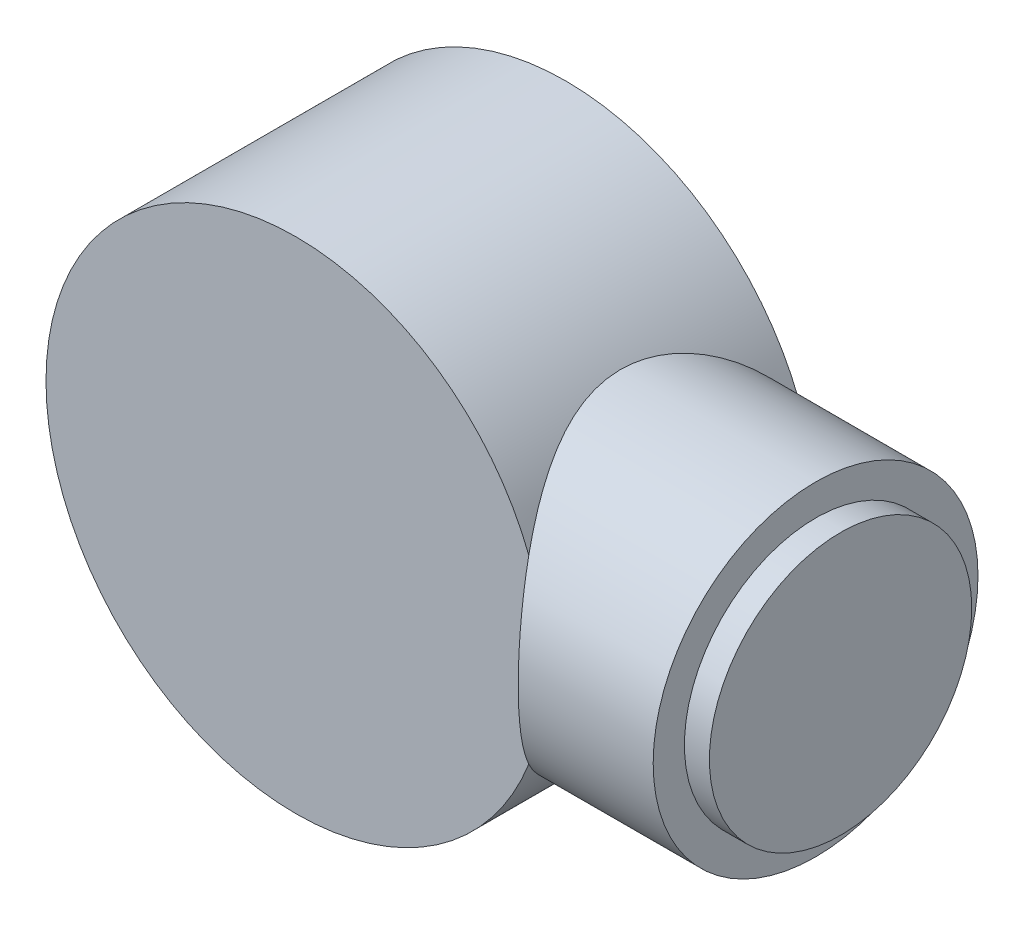
ISO-10303-21;
HEADER;
FILE_DESCRIPTION(('STEP AP214'),'2;1');
FILE_NAME('part.step','',(''),(''),'','','');
FILE_SCHEMA(('AUTOMOTIVE_DESIGN { 1 0 10303 214 1 1 1 1 }'));
ENDSEC;
DATA;
#1=APPLICATION_CONTEXT('core data for automotive mechanical design processes');
#2=APPLICATION_PROTOCOL_DEFINITION('international standard','automotive_design',2000,#1);
#3=PRODUCT_CONTEXT('',#1,'mechanical');
#4=PRODUCT('Part','Part','',(#3));
#5=PRODUCT_RELATED_PRODUCT_CATEGORY('part','',(#4));
#6=PRODUCT_DEFINITION_FORMATION('','',#4);
#7=PRODUCT_DEFINITION_CONTEXT('part definition',#1,'design');
#8=PRODUCT_DEFINITION('design','',#6,#7);
#9=PRODUCT_DEFINITION_SHAPE('','',#8);
#10=(LENGTH_UNIT() NAMED_UNIT(*) SI_UNIT(.MILLI.,.METRE.));
#11=(NAMED_UNIT(*) PLANE_ANGLE_UNIT() SI_UNIT($,.RADIAN.));
#12=(NAMED_UNIT(*) SI_UNIT($,.STERADIAN.) SOLID_ANGLE_UNIT());
#13=UNCERTAINTY_MEASURE_WITH_UNIT(LENGTH_MEASURE(1.E-05),#10,'distance_accuracy_value','');
#14=(GEOMETRIC_REPRESENTATION_CONTEXT(3) GLOBAL_UNCERTAINTY_ASSIGNED_CONTEXT((#13)) GLOBAL_UNIT_ASSIGNED_CONTEXT((#10,
#11,#12)) REPRESENTATION_CONTEXT('',''));
#15=CARTESIAN_POINT('',(0.,0.,0.));
#16=DIRECTION('',(0.,0.,1.));
#17=DIRECTION('',(1.,0.,0.));
#18=AXIS2_PLACEMENT_3D('',#15,#16,#17);
#19=CARTESIAN_POINT('',(0.,0.,54.));
#20=DIRECTION('',(0.,0.,-1.));
#21=DIRECTION('',(-1.,0.,0.));
#22=AXIS2_PLACEMENT_3D('',#19,#20,#21);
#23=CYLINDRICAL_SURFACE('',#22,50.);
#24=CARTESIAN_POINT('',(0.,0.,54.));
#25=DIRECTION('',(0.,0.,1.));
#26=DIRECTION('',(1.,0.,0.));
#27=AXIS2_PLACEMENT_3D('',#24,#25,#26);
#28=CIRCLE('',#27,50.);
#29=CARTESIAN_POINT('',(46.6127664915954,18.0900525151255,54.));
#30=VERTEX_POINT('',#29);
#31=CARTESIAN_POINT('',(46.6127664915954,-18.0900525151255,54.));
#32=VERTEX_POINT('',#31);
#33=EDGE_CURVE('E42',#30,#32,#28,.T.);
#34=ORIENTED_EDGE('',*,*,#33,.F.);
#35=CARTESIAN_POINT('',(50.,0.,-5.5));
#36=CARTESIAN_POINT('',(49.9999950832951,0.820379898340808,-5.49999466046045));
#37=CARTESIAN_POINT('',(49.9797625626082,1.64084726886599,-5.46889183519829));
#38=CARTESIAN_POINT('',(49.8993279047576,3.27517627569682,-5.34493934746414));
#39=CARTESIAN_POINT('',(49.8391202522668,4.08903698480234,-5.25208116466715));
#40=CARTESIAN_POINT('',(49.6801748227282,5.70432342494345,-5.00591516436292));
#41=CARTESIAN_POINT('',(49.5814093942654,6.50573980179267,-4.85256396392356));
#42=CARTESIAN_POINT('',(49.3477186738602,8.08972592140923,-4.48756849820513));
#43=CARTESIAN_POINT('',(49.212794126871,8.87229605208658,-4.2759254338575));
#44=CARTESIAN_POINT('',(48.9105837019917,10.409890979968,-3.79820184570894));
#45=CARTESIAN_POINT('',(48.7434562311797,11.1650299429453,-3.53238743761594));
#46=CARTESIAN_POINT('',(48.3799715633452,12.6475670057983,-2.94868585443072));
#47=CARTESIAN_POINT('',(48.1836142984633,13.3749650412661,-2.63079855844675));
#48=CARTESIAN_POINT('',(47.7655753618638,14.7986574365594,-1.9460483734245));
#49=CARTESIAN_POINT('',(47.5438947789436,15.4949531318671,-1.57918758992853));
#50=CARTESIAN_POINT('',(47.0793256843562,16.853866771853,-0.799477265192811));
#51=CARTESIAN_POINT('',(46.8364361825179,17.5164831418727,-0.38662557654837));
#52=CARTESIAN_POINT('',(46.31288226742,18.8594396012604,0.518300920156271));
#53=CARTESIAN_POINT('',(46.030755539401,19.5366956160193,1.01410599191766));
#54=CARTESIAN_POINT('',(45.4522443941303,20.8472210237898,2.05320041309447));
#55=CARTESIAN_POINT('',(45.1558593389838,21.4804884457185,2.59649188786588));
#56=CARTESIAN_POINT('',(44.5542181709047,22.7021098692218,3.72858800385993));
#57=CARTESIAN_POINT('',(44.2489510586984,23.2904045982318,4.31745071869159));
#58=CARTESIAN_POINT('',(43.635955205152,24.4195865043336,5.53782423965643));
#59=CARTESIAN_POINT('',(43.3282263201168,24.9604708916954,6.16933755157977));
#60=CARTESIAN_POINT('',(42.6711530158535,26.0700560672088,7.57025191176403));
#61=CARTESIAN_POINT('',(42.3224327873107,26.6309119255251,8.34618501317327));
#62=CARTESIAN_POINT('',(41.6406131212886,27.6848953678642,9.94957044777783));
#63=CARTESIAN_POINT('',(41.3075169872343,28.1780086711108,10.7770335907289));
#64=CARTESIAN_POINT('',(40.669017868988,29.0919462219696,12.4796375672601));
#65=CARTESIAN_POINT('',(40.3635774153682,29.5128689906529,13.3547112402174));
#66=CARTESIAN_POINT('',(39.7925815815168,30.2783525612671,15.1499984864518));
#67=CARTESIAN_POINT('',(39.5270080979029,30.6229480570224,16.0701913179829));
#68=CARTESIAN_POINT('',(39.1151707569848,31.1461312138078,17.6898576211882));
#69=CARTESIAN_POINT('',(38.9562369559204,31.3442611136038,18.3798478972654));
#70=CARTESIAN_POINT('',(38.6709512544293,31.695564794545,19.7777927595638));
#71=CARTESIAN_POINT('',(38.5445940631359,31.848745876524,20.4857444080825));
#72=CARTESIAN_POINT('',(38.328980642896,32.1079075043085,21.9148379579285));
#73=CARTESIAN_POINT('',(38.2396737765112,32.213952486247,22.6359604408029));
#74=CARTESIAN_POINT('',(38.1013167187525,32.3774801531489,24.0875823449805));
#75=CARTESIAN_POINT('',(38.0522668939434,32.4349623959195,24.8180818516057));
#76=CARTESIAN_POINT('',(37.9963316864904,32.5004721086949,26.2854803451552));
#77=CARTESIAN_POINT('',(37.9895935697563,32.508326850756,27.0223927537606));
#78=CARTESIAN_POINT('',(38.0189586121582,32.4739783985208,28.4941838153935));
#79=CARTESIAN_POINT('',(38.0550619680412,32.4317749743356,29.2290624590657));
#80=CARTESIAN_POINT('',(38.168648429343,32.298017031725,30.691581698894));
#81=CARTESIAN_POINT('',(38.2461617042717,32.2064265315171,31.4192166233723));
#82=CARTESIAN_POINT('',(38.43953216099,31.9753805209268,32.8616220334858));
#83=CARTESIAN_POINT('',(38.5553901243586,31.8359240348907,33.5763922565868));
#84=CARTESIAN_POINT('',(38.8165742872301,31.5168911106297,34.9639466936341));
#85=CARTESIAN_POINT('',(38.9607173353993,31.33890276179,35.6373226704315));
#86=CARTESIAN_POINT('',(39.2765368375223,30.9421702821062,36.9655787328999));
#87=CARTESIAN_POINT('',(39.4482240312041,30.7234102485866,37.6204514863652));
#88=CARTESIAN_POINT('',(39.8145826406525,30.247135742793,38.9093625725826));
#89=CARTESIAN_POINT('',(40.0092566397756,29.9896169137431,39.5433985533529));
#90=CARTESIAN_POINT('',(40.4170288058455,29.4377556466839,40.7888514561042));
#91=CARTESIAN_POINT('',(40.6301227285746,29.1434216844657,41.4002735425394));
#92=CARTESIAN_POINT('',(41.1140079381856,28.457817543033,42.7180777586586));
#93=CARTESIAN_POINT('',(41.3878797638847,28.0588852943435,43.4193502974399));
#94=CARTESIAN_POINT('',(41.949038749162,27.2127893027469,44.7865262043896));
#95=CARTESIAN_POINT('',(42.2363271724089,26.7656210114159,45.452426228251));
#96=CARTESIAN_POINT('',(42.8182561243996,25.8244717865271,46.7481253404724));
#97=CARTESIAN_POINT('',(43.1129043018876,25.330440520131,47.3778844200849));
#98=CARTESIAN_POINT('',(43.7033294929278,24.2975913742116,48.5989955295088));
#99=CARTESIAN_POINT('',(43.9991065762731,23.7587706814012,49.1903451426055));
#100=CARTESIAN_POINT('',(44.6433757161103,22.5286511323823,50.4440586838091));
#101=CARTESIAN_POINT('',(44.9909276528173,21.8280825337455,51.0978541444607));
#102=CARTESIAN_POINT('',(45.6707389230497,20.3674410882344,52.3444130595286));
#103=CARTESIAN_POINT('',(46.0029955959866,19.6073579505351,52.9371659176914));
#104=CARTESIAN_POINT('',(46.6432717696123,18.0313075910058,54.0565210365045));
#105=CARTESIAN_POINT('',(46.9513108856265,17.2153866190105,54.5831770437384));
#106=CARTESIAN_POINT('',(47.5350545534779,15.531013891883,55.5654939457799));
#107=CARTESIAN_POINT('',(47.8107680817938,14.6625768219423,56.0211745613144));
#108=CARTESIAN_POINT('',(48.2712989219017,13.0551073362084,56.773110475653));
#109=CARTESIAN_POINT('',(48.4633033177363,12.324514168495,57.0830659962705));
#110=CARTESIAN_POINT('',(48.8176192333411,10.8362739804481,57.6505975880767));
#111=CARTESIAN_POINT('',(48.979934361987,10.0786302616407,57.9081800258954));
#112=CARTESIAN_POINT('',(49.2713253417834,8.54098217221501,58.3678991154421));
#113=CARTESIAN_POINT('',(49.4004230450817,7.76099287899599,58.5700722240386));
#114=CARTESIAN_POINT('',(49.6226053964351,6.18317573262193,58.9166205684597));
#115=CARTESIAN_POINT('',(49.7156894160999,5.38534756845951,59.0609947957731));
#116=CARTESIAN_POINT('',(49.8639036202448,3.77460108589335,59.2903482323196));
#117=CARTESIAN_POINT('',(49.9188902972156,2.9616374291221,59.3751028808245));
#118=CARTESIAN_POINT('',(49.9889806039512,1.32990448445416,59.4830706056691));
#119=CARTESIAN_POINT('',(50.0040842099017,0.511135193091196,59.506283645262));
#120=CARTESIAN_POINT('',(49.9940280170243,-1.12558702772942,59.4908120509778));
#121=CARTESIAN_POINT('',(49.9688671194818,-1.9435399343006,59.4521257280265));
#122=CARTESIAN_POINT('',(49.8789112577068,-3.57199749573233,59.3134426463783));
#123=CARTESIAN_POINT('',(49.8141175484482,-4.38250238560966,59.2134478290158));
#124=CARTESIAN_POINT('',(49.6514918470381,-5.94197489256988,58.9613719584213));
#125=CARTESIAN_POINT('',(49.555854505623,-6.6917350268788,58.8127432372991));
#126=CARTESIAN_POINT('',(49.3329577485776,-8.1744282627694,58.4644026294863));
#127=CARTESIAN_POINT('',(49.2056998557011,-8.907362172797,58.2646932026805));
#128=CARTESIAN_POINT('',(48.9220905433369,-10.3523561917551,57.8164089830273));
#129=CARTESIAN_POINT('',(48.7657373107556,-11.0644149966383,57.5678311448613));
#130=CARTESIAN_POINT('',(48.4268841832775,-12.4641703227049,57.0242943573914));
#131=CARTESIAN_POINT('',(48.2443828654948,-13.1518655155656,56.7293328839699));
#132=CARTESIAN_POINT('',(47.8429790386047,-14.5468935746808,56.0735703190451));
#133=CARTESIAN_POINT('',(47.6224282140744,-15.2522697974981,55.7096182026578));
#134=CARTESIAN_POINT('',(47.1593126222709,-16.629097865148,54.9346965691568));
#135=CARTESIAN_POINT('',(46.9167470587903,-17.3005484816245,54.5237253513626));
#136=CARTESIAN_POINT('',(46.4138194489232,-18.607742420822,53.6574027719117));
#137=CARTESIAN_POINT('',(46.1534470794155,-19.2434646350104,53.2020256005709));
#138=CARTESIAN_POINT('',(45.619526143917,-20.4770764710835,52.2496858797039));
#139=CARTESIAN_POINT('',(45.3459768617906,-21.074964032645,51.7527210688985));
#140=CARTESIAN_POINT('',(44.7471563176791,-22.3213173683831,50.6391921817521));
#141=CARTESIAN_POINT('',(44.4204496488134,-22.9632199419752,50.0160396905248));
#142=CARTESIAN_POINT('',(43.7630045869561,-24.1926746957852,48.7200933671887));
#143=CARTESIAN_POINT('',(43.4322656332202,-24.7802192169113,48.047292563529));
#144=CARTESIAN_POINT('',(42.7745161992376,-25.8990740511106,46.6541722015348));
#145=CARTESIAN_POINT('',(42.4475074152823,-26.4303596241356,45.9338319617479));
#146=CARTESIAN_POINT('',(41.8059041408205,-27.4339387672869,44.4479953540767));
#147=CARTESIAN_POINT('',(41.4913079318813,-27.906240523045,43.6825052737353));
#148=CARTESIAN_POINT('',(40.9200564815249,-28.7362441351099,42.2022955754751));
#149=CARTESIAN_POINT('',(40.6609659921665,-29.1008956870287,41.4924109597111));
#150=CARTESIAN_POINT('',(40.1664965087985,-29.779672463042,40.0408179524925));
#151=CARTESIAN_POINT('',(39.9311170218804,-30.0937987375458,39.2991102230396));
#152=CARTESIAN_POINT('',(39.4917120575915,-30.6681484086005,37.7873745813625));
#153=CARTESIAN_POINT('',(39.287640214774,-30.9284517177363,37.0173906827655));
#154=CARTESIAN_POINT('',(38.9178700773443,-31.3924770297742,35.4515519018164));
#155=CARTESIAN_POINT('',(38.7521647978538,-31.5962093331374,34.6557017587133));
#156=CARTESIAN_POINT('',(38.487621867937,-31.9176987315613,33.1645325250141));
#157=CARTESIAN_POINT('',(38.3824721686329,-32.0437830280959,32.4721239485102));
#158=CARTESIAN_POINT('',(38.2084463267924,-32.2510939378217,31.0761112799988));
#159=CARTESIAN_POINT('',(38.139566259711,-32.3323254043466,30.3725084077581));
#160=CARTESIAN_POINT('',(38.0406628594831,-32.4486339223221,28.95921823179));
#161=CARTESIAN_POINT('',(38.0106142233053,-32.4837410292135,28.2495351938049));
#162=CARTESIAN_POINT('',(37.9904569091207,-32.5073136396741,26.8288028909469));
#163=CARTESIAN_POINT('',(38.0003490888071,-32.495778141635,26.1177535970627));
#164=CARTESIAN_POINT('',(38.059663883183,-32.4262861105484,24.700175772028));
#165=CARTESIAN_POINT('',(38.1090550774856,-32.368366474764,23.9936440973489));
#166=CARTESIAN_POINT('',(38.2454441231086,-32.2070967599132,22.5895137156665));
#167=CARTESIAN_POINT('',(38.3324416199641,-32.1037471090554,21.8919149245286));
#168=CARTESIAN_POINT('',(38.5410535221566,-31.8530019051811,20.509194774244));
#169=CARTESIAN_POINT('',(38.662705517609,-31.7055585145022,19.824087828478));
#170=CARTESIAN_POINT('',(38.9366337080108,-31.3685451393114,18.4705803278069));
#171=CARTESIAN_POINT('',(39.0889139006484,-31.1789696552474,17.8021819665759));
#172=CARTESIAN_POINT('',(39.4681515862117,-30.6982762499881,16.291855828066));
#173=CARTESIAN_POINT('',(39.7039201757252,-30.3936788069919,15.4564089668611));
#174=CARTESIAN_POINT('',(40.2095373547831,-29.721538113857,13.821926549327));
#175=CARTESIAN_POINT('',(40.4793956364613,-29.3539769517075,13.0229014364316));
#176=CARTESIAN_POINT('',(41.0440210917243,-28.5591694410698,11.4632462946186));
#177=CARTESIAN_POINT('',(41.3388144790771,-28.1318599644147,10.7026580493571));
#178=CARTESIAN_POINT('',(41.9442700701395,-27.2208981243104,9.22283282769884));
#179=CARTESIAN_POINT('',(42.2549313196396,-26.7372491465867,8.50359337032016));
#180=CARTESIAN_POINT('',(42.8889875449583,-25.7080858845502,7.09735699713856));
#181=CARTESIAN_POINT('',(43.2125052568565,-25.1617288893835,6.41103263250462));
#182=CARTESIAN_POINT('',(43.8598896717567,-24.0154817005351,5.0848268798128));
#183=CARTESIAN_POINT('',(44.1837563765708,-23.4155912275827,4.4449457340691));
#184=CARTESIAN_POINT('',(44.8246827044135,-22.1639850361142,3.2139037879028));
#185=CARTESIAN_POINT('',(45.1417405445902,-21.5122559491886,2.62275563555921));
#186=CARTESIAN_POINT('',(45.7620737335855,-20.1590357237669,1.49234233674686));
#187=CARTESIAN_POINT('',(46.0653483829597,-19.4575420645242,0.953079821728656));
#188=CARTESIAN_POINT('',(46.6810020521624,-17.9339091298916,-0.121560308825123));
#189=CARTESIAN_POINT('',(46.991220745991,-17.1067350387869,-0.651074470906869));
#190=CARTESIAN_POINT('',(47.5783138826708,-15.3986971256461,-1.63744016453904));
#191=CARTESIAN_POINT('',(47.855183285751,-14.5178252189714,-2.09428071693315));
#192=CARTESIAN_POINT('',(48.3668793423392,-12.7092691977611,-2.92847198378674));
#193=CARTESIAN_POINT('',(48.6017836772997,-11.7816757386604,-3.30596980304276));
#194=CARTESIAN_POINT('',(48.917289614073,-10.3602514667507,-3.80857072157964));
#195=CARTESIAN_POINT('',(49.016307598532,-9.88149221910737,-3.96548291174638));
#196=CARTESIAN_POINT('',(49.2013116274098,-8.91476468347579,-4.25750903195082));
#197=CARTESIAN_POINT('',(49.2872955229403,-8.42679489185499,-4.39261936782316));
#198=CARTESIAN_POINT('',(49.4696847366718,-7.29205135260537,-4.67830917492835));
#199=CARTESIAN_POINT('',(49.561201378512,-6.6424628353478,-4.82092889076201));
#200=CARTESIAN_POINT('',(49.7191592253278,-5.33292853081827,-5.06639380811066));
#201=CARTESIAN_POINT('',(49.7856047759838,-4.67298455917691,-5.1692459027954));
#202=CARTESIAN_POINT('',(49.8923502038399,-3.34607343613181,-5.33420136120816));
#203=CARTESIAN_POINT('',(49.9326568726316,-2.67910815486154,-5.39631530986083));
#204=CARTESIAN_POINT('',(49.9864860599114,-1.3414484839905,-5.47922032849765));
#205=CARTESIAN_POINT('',(50.0000040199631,-0.670753479198282,-5.50000436567832));
#206=CARTESIAN_POINT('',(50.,0.,-5.5));
#207=B_SPLINE_CURVE_WITH_KNOTS('',3,(#35,#36,#37,#38,#39,#40,#41,#42,#43,#44,#45,#46,#47,#48,
#49,#50,#51,#52,#53,#54,#55,#56,#57,#58,#59,#60,#61,#62,#63,#64,#65,#66,#67,#68,#69,#70,#71,#72,
#73,#74,#75,#76,#77,#78,#79,#80,#81,#82,#83,#84,#85,#86,#87,#88,#89,#90,#91,#92,#93,#94,#95,#96,
#97,#98,#99,#100,#101,#102,#103,#104,#105,#106,#107,#108,#109,#110,#111,#112,#113,#114,#115,
#116,#117,#118,#119,#120,#121,#122,#123,#124,#125,#126,#127,#128,#129,#130,#131,#132,#133,#134,
#135,#136,#137,#138,#139,#140,#141,#142,#143,#144,#145,#146,#147,#148,#149,#150,#151,#152,#153,
#154,#155,#156,#157,#158,#159,#160,#161,#162,#163,#164,#165,#166,#167,#168,#169,#170,#171,#172,
#173,#174,#175,#176,#177,#178,#179,#180,#181,#182,#183,#184,#185,#186,#187,#188,#189,#190,#191,
#192,#193,#194,#195,#196,#197,#198,#199,#200,#201,#202,#203,#204,#205,#206),.UNSPECIFIED.,.T.,
.F.,(4,2,2,2,2,2,2,2,2,2,2,2,2,2,2,2,2,2,2,2,2,2,2,2,2,2,2,2,2,2,2,2,2,2,2,2,2,2,2,2,2,2,2,2,2,
2,2,2,2,2,2,2,2,2,2,2,2,2,2,2,2,2,2,2,2,2,2,2,2,2,2,2,2,2,2,2,2,2,2,2,2,2,2,2,2,4),(0.,
2.46045993003765,4.92125939771797,7.38382686034164,9.84634359284154,12.2970428769451,
14.7477478506417,17.1983474938338,19.6490616082808,22.3029292718831,24.9569157759163,
27.6143419106252,30.2719243093767,33.3251156223354,36.3789495926578,39.4285821341122,
42.4768256369194,44.6805266408034,46.8838695090903,49.0841910232989,51.2845325725393,
53.4925281856819,55.7005339389497,57.9101505497284,60.1198122018549,62.2515577277178,
64.3841364708946,66.5169551110068,68.6492836220793,71.2029639599345,73.7568853082476,
76.3135814239511,78.8704382508673,81.9247620382729,84.9796151285971,88.031967848395,
91.0834709439921,93.5305607781958,95.9773529586959,98.4225313729449,100.867752450345,
103.322134985925,105.776518987026,108.230969963086,110.685343222929,112.993712174889,
115.301969984042,117.61037168185,119.918899042404,122.38786060554,124.85691149924,
127.327406109676,129.798035137756,132.652317947386,135.507002317129,138.362936875042,
141.218474651779,143.733409825373,146.248292707263,148.759414421274,151.270078609418,
153.402630947015,155.534952484961,157.665883874566,159.796861024257,161.926144723967,
164.055408354167,166.186990472554,168.318850992474,171.074796064786,173.83152645837,
176.591191849729,179.35069148432,182.152963084706,184.955249304694,187.758260550462,
190.5614138799,193.646940868185,196.73293356028,199.813153211307,201.352923022289,
202.892946414719,204.905180739947,206.91706611552,208.928428538954,210.940133191687),.UNSPECIFIED.);
#208=CARTESIAN_POINT('',(46.6127664915954,18.0900525151255,0.));
#209=VERTEX_POINT('',#208);
#210=EDGE_CURVE('E69',#209,#30,#207,.T.);
#211=ORIENTED_EDGE('',*,*,#210,.F.);
#212=CARTESIAN_POINT('',(0.,0.,0.));
#213=DIRECTION('',(0.,0.,1.));
#214=DIRECTION('',(1.,0.,0.));
#215=AXIS2_PLACEMENT_3D('',#212,#213,#214);
#216=CIRCLE('',#215,50.);
#217=CARTESIAN_POINT('',(46.6127664915954,-18.0900525151255,0.));
#218=VERTEX_POINT('',#217);
#219=EDGE_CURVE('E37',#209,#218,#216,.T.);
#220=ORIENTED_EDGE('',*,*,#219,.T.);
#221=EDGE_CURVE('E50',#32,#218,#207,.T.);
#222=ORIENTED_EDGE('',*,*,#221,.F.);
#223=EDGE_LOOP('',(#34,#211,#220,#222));
#224=FACE_BOUND('',#223,.T.);
#225=ADVANCED_FACE('F34',(#224),#23,.T.);
#226=CARTESIAN_POINT('',(0.,0.,54.));
#227=DIRECTION('',(0.,0.,1.));
#228=DIRECTION('',(1.,0.,0.));
#229=AXIS2_PLACEMENT_3D('',#226,#227,#228);
#230=PLANE('',#229);
#231=ORIENTED_EDGE('',*,*,#33,.T.);
#232=CARTESIAN_POINT('',(0.,0.,54.));
#233=DIRECTION('',(0.,0.,1.));
#234=DIRECTION('',(1.,0.,0.));
#235=AXIS2_PLACEMENT_3D('',#232,#233,#234);
#236=CIRCLE('',#235,50.);
#237=EDGE_CURVE('E56',#30,#32,#236,.F.);
#238=ORIENTED_EDGE('',*,*,#237,.F.);
#239=EDGE_LOOP('',(#231,#238));
#240=FACE_BOUND('',#239,.T.);
#241=ADVANCED_FACE('F112',(#240),#230,.T.);
#242=CARTESIAN_POINT('',(0.,0.,0.));
#243=DIRECTION('',(0.,0.,1.));
#244=DIRECTION('',(1.,0.,0.));
#245=AXIS2_PLACEMENT_3D('',#242,#243,#244);
#246=PLANE('',#245);
#247=ORIENTED_EDGE('',*,*,#219,.F.);
#248=EDGE_CURVE('E66',#218,#209,#216,.T.);
#249=ORIENTED_EDGE('',*,*,#248,.F.);
#250=EDGE_LOOP('',(#247,#249));
#251=FACE_BOUND('',#250,.T.);
#252=ADVANCED_FACE('F64',(#251),#246,.F.);
#253=CARTESIAN_POINT('',(0.,0.,54.));
#254=DIRECTION('',(0.,0.,-1.));
#255=DIRECTION('',(-1.,0.,0.));
#256=AXIS2_PLACEMENT_3D('',#253,#254,#255);
#257=CYLINDRICAL_SURFACE('',#256,50.);
#258=ORIENTED_EDGE('',*,*,#248,.T.);
#259=EDGE_CURVE('E76',#218,#209,#207,.T.);
#260=ORIENTED_EDGE('',*,*,#259,.F.);
#261=EDGE_LOOP('',(#258,#260));
#262=FACE_BOUND('',#261,.T.);
#263=ADVANCED_FACE('F78',(#262),#257,.F.);
#264=CARTESIAN_POINT('',(77.,0.,27.));
#265=DIRECTION('',(1.,0.,0.));
#266=DIRECTION('',(0.,0.,-1.));
#267=AXIS2_PLACEMENT_3D('',#264,#265,#266);
#268=PLANE('',#267);
#269=CARTESIAN_POINT('',(77.,0.,27.));
#270=DIRECTION('',(1.,0.,0.));
#271=DIRECTION('',(0.,0.,-1.));
#272=AXIS2_PLACEMENT_3D('',#269,#270,#271);
#273=CIRCLE('',#272,26.25);
#274=CARTESIAN_POINT('',(77.,0.,0.750000000000001));
#275=VERTEX_POINT('',#274);
#276=EDGE_CURVE('E11',#275,#275,#273,.T.);
#277=ORIENTED_EDGE('',*,*,#276,.F.);
#278=EDGE_LOOP('',(#277));
#279=FACE_BOUND('',#278,.T.);
#280=CARTESIAN_POINT('',(77.,0.,27.));
#281=DIRECTION('',(1.,0.,0.));
#282=DIRECTION('',(0.,0.,-1.));
#283=AXIS2_PLACEMENT_3D('',#280,#281,#282);
#284=CIRCLE('',#283,32.5);
#285=CARTESIAN_POINT('',(77.,0.,-5.5));
#286=VERTEX_POINT('',#285);
#287=EDGE_CURVE('E80',#286,#286,#284,.T.);
#288=ORIENTED_EDGE('',*,*,#287,.T.);
#289=EDGE_LOOP('',(#288));
#290=FACE_BOUND('',#289,.T.);
#291=ADVANCED_FACE('F98',(#279,#290),#268,.T.);
#292=CARTESIAN_POINT('',(-50.001,0.,27.));
#293=DIRECTION('',(1.,0.,0.));
#294=DIRECTION('',(0.,0.,-1.));
#295=AXIS2_PLACEMENT_3D('',#292,#293,#294);
#296=CYLINDRICAL_SURFACE('',#295,32.5);
#297=ORIENTED_EDGE('',*,*,#287,.F.);
#298=EDGE_LOOP('',(#297));
#299=FACE_BOUND('',#298,.T.);
#300=ORIENTED_EDGE('',*,*,#210,.T.);
#301=EDGE_CURVE('E74',#30,#32,#207,.T.);
#302=ORIENTED_EDGE('',*,*,#301,.T.);
#303=ORIENTED_EDGE('',*,*,#221,.T.);
#304=ORIENTED_EDGE('',*,*,#259,.T.);
#305=EDGE_LOOP('',(#300,#302,#303,#304));
#306=FACE_BOUND('',#305,.T.);
#307=ADVANCED_FACE('F79',(#299,#306),#296,.T.);
#308=ORIENTED_EDGE('',*,*,#301,.F.);
#309=ORIENTED_EDGE('',*,*,#237,.T.);
#310=EDGE_LOOP('',(#308,#309));
#311=FACE_BOUND('',#310,.T.);
#312=ADVANCED_FACE('F92',(#311),#257,.F.);
#313=CARTESIAN_POINT('',(82.,0.,27.));
#314=DIRECTION('',(-1.,0.,0.));
#315=DIRECTION('',(0.,0.,1.));
#316=AXIS2_PLACEMENT_3D('',#313,#314,#315);
#317=CYLINDRICAL_SURFACE('',#316,26.25);
#318=CARTESIAN_POINT('',(82.,0.,27.));
#319=DIRECTION('',(1.,0.,0.));
#320=DIRECTION('',(0.,0.,-1.));
#321=AXIS2_PLACEMENT_3D('',#318,#319,#320);
#322=CIRCLE('',#321,26.25);
#323=CARTESIAN_POINT('',(82.,0.,0.750000000000001));
#324=VERTEX_POINT('',#323);
#325=EDGE_CURVE('E82',#324,#324,#322,.T.);
#326=ORIENTED_EDGE('',*,*,#325,.F.);
#327=EDGE_LOOP('',(#326));
#328=FACE_BOUND('',#327,.T.);
#329=ORIENTED_EDGE('',*,*,#276,.T.);
#330=EDGE_LOOP('',(#329));
#331=FACE_BOUND('',#330,.T.);
#332=ADVANCED_FACE('F96',(#328,#331),#317,.T.);
#333=CARTESIAN_POINT('',(82.,0.,27.));
#334=DIRECTION('',(1.,0.,0.));
#335=DIRECTION('',(0.,0.,-1.));
#336=AXIS2_PLACEMENT_3D('',#333,#334,#335);
#337=PLANE('',#336);
#338=ORIENTED_EDGE('',*,*,#325,.T.);
#339=EDGE_LOOP('',(#338));
#340=FACE_BOUND('',#339,.T.);
#341=ADVANCED_FACE('F104',(#340),#337,.T.);
#342=CLOSED_SHELL('',(#225,#241,#252,#263,#291,#307,#312,#332,#341));
#343=MANIFOLD_SOLID_BREP('B2',#342);
#344=ADVANCED_BREP_SHAPE_REPRESENTATION('',(#18,#343),#14);
#345=SHAPE_DEFINITION_REPRESENTATION(#9,#344);
ENDSEC;
END-ISO-10303-21;
